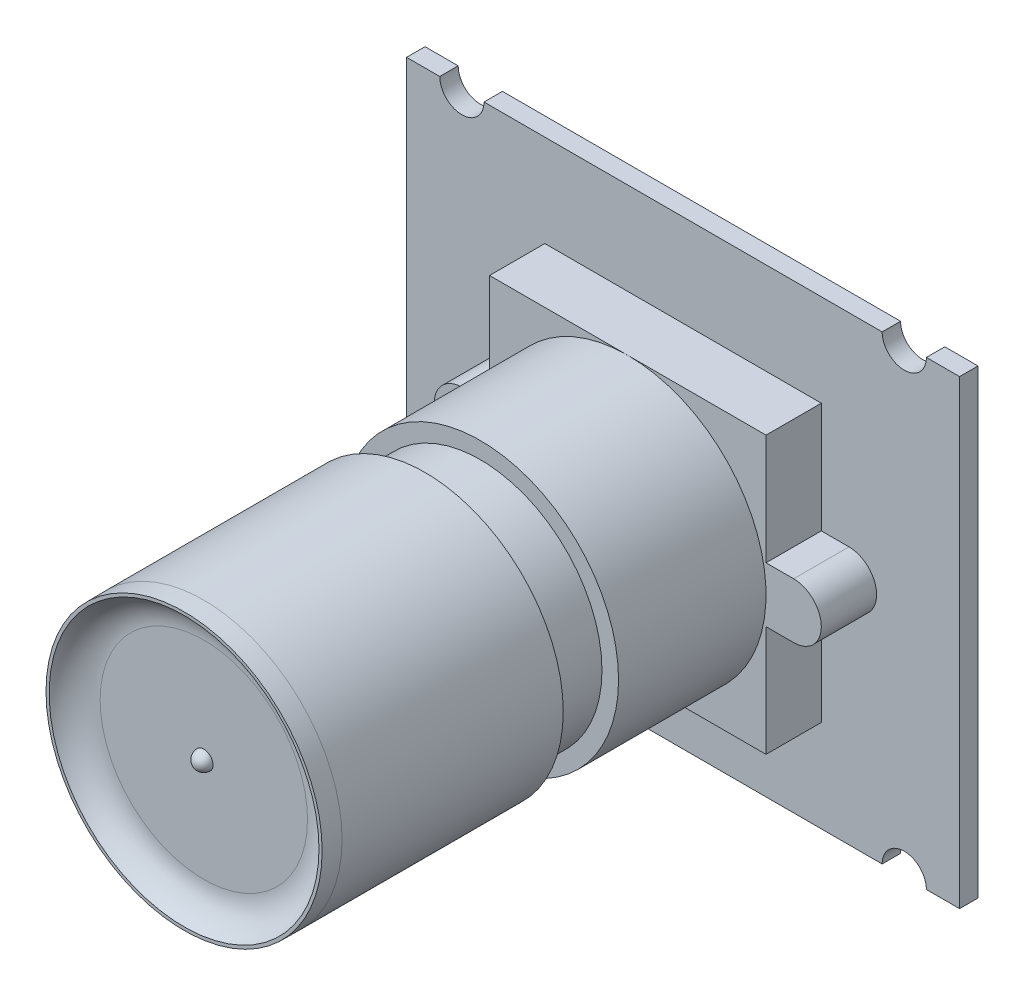
ISO-10303-21;
HEADER;
FILE_DESCRIPTION(('STEP AP214'),'2;1');
FILE_NAME('part.step','',(''),(''),'','','');
FILE_SCHEMA(('AUTOMOTIVE_DESIGN { 1 0 10303 214 1 1 1 1 }'));
ENDSEC;
DATA;
#1=APPLICATION_CONTEXT('core data for automotive mechanical design processes');
#2=APPLICATION_PROTOCOL_DEFINITION('international standard','automotive_design',2000,#1);
#3=PRODUCT_CONTEXT('',#1,'mechanical');
#4=PRODUCT('Part','Part','',(#3));
#5=PRODUCT_RELATED_PRODUCT_CATEGORY('part','',(#4));
#6=PRODUCT_DEFINITION_FORMATION('','',#4);
#7=PRODUCT_DEFINITION_CONTEXT('part definition',#1,'design');
#8=PRODUCT_DEFINITION('design','',#6,#7);
#9=PRODUCT_DEFINITION_SHAPE('','',#8);
#10=(LENGTH_UNIT() NAMED_UNIT(*) SI_UNIT(.MILLI.,.METRE.));
#11=(NAMED_UNIT(*) PLANE_ANGLE_UNIT() SI_UNIT($,.RADIAN.));
#12=(NAMED_UNIT(*) SI_UNIT($,.STERADIAN.) SOLID_ANGLE_UNIT());
#13=UNCERTAINTY_MEASURE_WITH_UNIT(LENGTH_MEASURE(1.E-05),#10,'distance_accuracy_value','');
#14=(GEOMETRIC_REPRESENTATION_CONTEXT(3) GLOBAL_UNCERTAINTY_ASSIGNED_CONTEXT((#13)) GLOBAL_UNIT_ASSIGNED_CONTEXT((#10,
#11,#12)) REPRESENTATION_CONTEXT('',''));
#15=CARTESIAN_POINT('',(0.,0.,0.));
#16=DIRECTION('',(0.,0.,1.));
#17=DIRECTION('',(1.,0.,0.));
#18=AXIS2_PLACEMENT_3D('',#15,#16,#17);
#19=CARTESIAN_POINT('',(6.,-3.54395604395604,4.));
#20=DIRECTION('',(0.,0.,1.));
#21=DIRECTION('',(1.,0.,0.));
#22=AXIS2_PLACEMENT_3D('',#19,#20,#21);
#23=PLANE('',#22);
#24=CARTESIAN_POINT('',(15.,-3.54395604395604,4.));
#25=DIRECTION('',(0.,0.,1.));
#26=DIRECTION('',(1.,0.,0.));
#27=AXIS2_PLACEMENT_3D('',#24,#25,#26);
#28=CIRCLE('',#27,7.5);
#29=CARTESIAN_POINT('',(15.,3.95604395604396,4.));
#30=VERTEX_POINT('',#29);
#31=CARTESIAN_POINT('',(15.,-11.043956043956,4.));
#32=VERTEX_POINT('',#31);
#33=EDGE_CURVE('E226',#30,#32,#28,.T.);
#34=ORIENTED_EDGE('',*,*,#33,.F.);
#35=DIRECTION('',(-1.,0.,0.));
#36=VECTOR('',#35,1.);
#37=CARTESIAN_POINT('',(7.5,3.95604395604396,4.));
#38=LINE('',#37,#36);
#39=CARTESIAN_POINT('',(7.5,3.95604395604396,4.));
#40=VERTEX_POINT('',#39);
#41=EDGE_CURVE('E214',#30,#40,#38,.T.);
#42=ORIENTED_EDGE('',*,*,#41,.T.);
#43=DIRECTION('',(0.,-1.,0.));
#44=VECTOR('',#43,1.);
#45=CARTESIAN_POINT('',(7.5,3.95604395604396,4.));
#46=LINE('',#45,#44);
#47=CARTESIAN_POINT('',(7.5,-2.04395604395604,4.));
#48=VERTEX_POINT('',#47);
#49=EDGE_CURVE('E239',#40,#48,#46,.T.);
#50=ORIENTED_EDGE('',*,*,#49,.T.);
#51=DIRECTION('',(-1.,0.,0.));
#52=VECTOR('',#51,1.);
#53=CARTESIAN_POINT('',(6.,-2.04395604395604,4.));
#54=LINE('',#53,#52);
#55=CARTESIAN_POINT('',(6.,-2.04395604395604,4.));
#56=VERTEX_POINT('',#55);
#57=EDGE_CURVE('E281',#48,#56,#54,.T.);
#58=ORIENTED_EDGE('',*,*,#57,.T.);
#59=CARTESIAN_POINT('',(6.,-3.54395604395604,4.));
#60=DIRECTION('',(0.,0.,1.));
#61=DIRECTION('',(1.,0.,0.));
#62=AXIS2_PLACEMENT_3D('',#59,#60,#61);
#63=CIRCLE('',#62,1.5);
#64=CARTESIAN_POINT('',(6.,-5.04395604395604,4.));
#65=VERTEX_POINT('',#64);
#66=EDGE_CURVE('E274',#56,#65,#63,.T.);
#67=ORIENTED_EDGE('',*,*,#66,.T.);
#68=DIRECTION('',(1.,0.,0.));
#69=VECTOR('',#68,1.);
#70=CARTESIAN_POINT('',(6.,-5.04395604395604,4.));
#71=LINE('',#70,#69);
#72=CARTESIAN_POINT('',(7.5,-5.04395604395604,4.));
#73=VERTEX_POINT('',#72);
#74=EDGE_CURVE('E278',#65,#73,#71,.T.);
#75=ORIENTED_EDGE('',*,*,#74,.T.);
#76=CARTESIAN_POINT('',(7.5,-11.043956043956,4.));
#77=VERTEX_POINT('',#76);
#78=EDGE_CURVE('E243',#73,#77,#46,.T.);
#79=ORIENTED_EDGE('',*,*,#78,.T.);
#80=DIRECTION('',(1.,0.,0.));
#81=VECTOR('',#80,1.);
#82=CARTESIAN_POINT('',(7.5,-11.043956043956,4.));
#83=LINE('',#82,#81);
#84=EDGE_CURVE('E229',#77,#32,#83,.T.);
#85=ORIENTED_EDGE('',*,*,#84,.T.);
#86=EDGE_LOOP('',(#34,#42,#50,#58,#67,#75,#79,#85));
#87=FACE_BOUND('',#86,.T.);
#88=ADVANCED_FACE('F39',(#87),#23,.T.);
#89=CARTESIAN_POINT('',(6.,-5.04395604395604,4.));
#90=DIRECTION('',(0.,1.,0.));
#91=DIRECTION('',(0.,0.,1.));
#92=AXIS2_PLACEMENT_3D('',#89,#90,#91);
#93=PLANE('',#92);
#94=DIRECTION('',(0.,0.,-1.));
#95=VECTOR('',#94,1.);
#96=CARTESIAN_POINT('',(7.5,-5.04395604395604,4.));
#97=LINE('',#96,#95);
#98=CARTESIAN_POINT('',(7.5,-5.04395604395604,1.));
#99=VERTEX_POINT('',#98);
#100=EDGE_CURVE('E268',#73,#99,#97,.T.);
#101=ORIENTED_EDGE('',*,*,#100,.F.);
#102=ORIENTED_EDGE('',*,*,#74,.F.);
#103=DIRECTION('',(0.,0.,-1.));
#104=VECTOR('',#103,1.);
#105=CARTESIAN_POINT('',(6.,-5.04395604395604,4.));
#106=LINE('',#105,#104);
#107=CARTESIAN_POINT('',(6.,-5.04395604395604,1.));
#108=VERTEX_POINT('',#107);
#109=EDGE_CURVE('E310',#65,#108,#106,.T.);
#110=ORIENTED_EDGE('',*,*,#109,.T.);
#111=DIRECTION('',(1.,0.,0.));
#112=VECTOR('',#111,1.);
#113=CARTESIAN_POINT('',(6.,-5.04395604395604,1.));
#114=LINE('',#113,#112);
#115=EDGE_CURVE('E293',#108,#99,#114,.T.);
#116=ORIENTED_EDGE('',*,*,#115,.T.);
#117=EDGE_LOOP('',(#101,#102,#110,#116));
#118=FACE_BOUND('',#117,.T.);
#119=ADVANCED_FACE('F425',(#118),#93,.F.);
#120=DIRECTION('',(0.,0.,1.));
#121=VECTOR('',#120,1.);
#122=CARTESIAN_POINT('',(22.5,-5.04395604395604,4.));
#123=LINE('',#122,#121);
#124=CARTESIAN_POINT('',(22.5,-5.04395604395604,1.));
#125=VERTEX_POINT('',#124);
#126=CARTESIAN_POINT('',(22.5,-5.04395604395604,4.));
#127=VERTEX_POINT('',#126);
#128=EDGE_CURVE('E269',#125,#127,#123,.T.);
#129=ORIENTED_EDGE('',*,*,#128,.F.);
#130=CARTESIAN_POINT('',(24.,-5.04395604395604,1.));
#131=VERTEX_POINT('',#130);
#132=EDGE_CURVE('E288',#125,#131,#114,.T.);
#133=ORIENTED_EDGE('',*,*,#132,.T.);
#134=DIRECTION('',(0.,0.,-1.));
#135=VECTOR('',#134,1.);
#136=CARTESIAN_POINT('',(24.,-5.04395604395604,4.));
#137=LINE('',#136,#135);
#138=CARTESIAN_POINT('',(24.,-5.04395604395604,4.));
#139=VERTEX_POINT('',#138);
#140=EDGE_CURVE('E302',#139,#131,#137,.T.);
#141=ORIENTED_EDGE('',*,*,#140,.F.);
#142=EDGE_CURVE('E280',#127,#139,#71,.T.);
#143=ORIENTED_EDGE('',*,*,#142,.F.);
#144=EDGE_LOOP('',(#129,#133,#141,#143));
#145=FACE_BOUND('',#144,.T.);
#146=ADVANCED_FACE('F436',(#145),#93,.F.);
#147=CARTESIAN_POINT('',(6.,-2.04395604395604,4.));
#148=DIRECTION('',(0.,-1.,0.));
#149=DIRECTION('',(0.,0.,-1.));
#150=AXIS2_PLACEMENT_3D('',#147,#148,#149);
#151=PLANE('',#150);
#152=DIRECTION('',(0.,0.,1.));
#153=VECTOR('',#152,1.);
#154=CARTESIAN_POINT('',(7.5,-2.04395604395604,4.));
#155=LINE('',#154,#153);
#156=CARTESIAN_POINT('',(7.5,-2.04395604395604,1.));
#157=VERTEX_POINT('',#156);
#158=EDGE_CURVE('E43',#157,#48,#155,.T.);
#159=ORIENTED_EDGE('',*,*,#158,.F.);
#160=DIRECTION('',(-1.,0.,0.));
#161=VECTOR('',#160,1.);
#162=CARTESIAN_POINT('',(6.,-2.04395604395604,1.));
#163=LINE('',#162,#161);
#164=CARTESIAN_POINT('',(6.,-2.04395604395604,1.));
#165=VERTEX_POINT('',#164);
#166=EDGE_CURVE('E300',#157,#165,#163,.T.);
#167=ORIENTED_EDGE('',*,*,#166,.T.);
#168=DIRECTION('',(0.,0.,-1.));
#169=VECTOR('',#168,1.);
#170=CARTESIAN_POINT('',(6.,-2.04395604395604,4.));
#171=LINE('',#170,#169);
#172=EDGE_CURVE('E289',#56,#165,#171,.T.);
#173=ORIENTED_EDGE('',*,*,#172,.F.);
#174=ORIENTED_EDGE('',*,*,#57,.F.);
#175=EDGE_LOOP('',(#159,#167,#173,#174));
#176=FACE_BOUND('',#175,.T.);
#177=ADVANCED_FACE('F416',(#176),#151,.F.);
#178=DIRECTION('',(0.,0.,-1.));
#179=VECTOR('',#178,1.);
#180=CARTESIAN_POINT('',(22.5,-2.04395604395604,4.));
#181=LINE('',#180,#179);
#182=CARTESIAN_POINT('',(22.5,-2.04395604395604,4.));
#183=VERTEX_POINT('',#182);
#184=CARTESIAN_POINT('',(22.5,-2.04395604395604,1.));
#185=VERTEX_POINT('',#184);
#186=EDGE_CURVE('E240',#183,#185,#181,.T.);
#187=ORIENTED_EDGE('',*,*,#186,.F.);
#188=CARTESIAN_POINT('',(24.,-2.04395604395604,4.));
#189=VERTEX_POINT('',#188);
#190=EDGE_CURVE('E283',#189,#183,#54,.T.);
#191=ORIENTED_EDGE('',*,*,#190,.F.);
#192=DIRECTION('',(0.,0.,-1.));
#193=VECTOR('',#192,1.);
#194=CARTESIAN_POINT('',(24.,-2.04395604395604,4.));
#195=LINE('',#194,#193);
#196=CARTESIAN_POINT('',(24.,-2.04395604395604,1.));
#197=VERTEX_POINT('',#196);
#198=EDGE_CURVE('E301',#189,#197,#195,.T.);
#199=ORIENTED_EDGE('',*,*,#198,.T.);
#200=EDGE_CURVE('E277',#197,#185,#163,.T.);
#201=ORIENTED_EDGE('',*,*,#200,.T.);
#202=EDGE_LOOP('',(#187,#191,#199,#201));
#203=FACE_BOUND('',#202,.T.);
#204=ADVANCED_FACE('F405',(#203),#151,.F.);
#205=CARTESIAN_POINT('',(0.,8.95604395604396,1.));
#206=DIRECTION('',(1.,0.,0.));
#207=DIRECTION('',(0.,1.,0.));
#208=AXIS2_PLACEMENT_3D('',#205,#206,#207);
#209=PLANE('',#208);
#210=DIRECTION('',(0.,-1.,0.));
#211=VECTOR('',#210,1.);
#212=CARTESIAN_POINT('',(0.,8.95604395604396,0.));
#213=LINE('',#212,#211);
#214=CARTESIAN_POINT('',(0.,8.95604395604396,0.));
#215=VERTEX_POINT('',#214);
#216=CARTESIAN_POINT('',(0.,-16.043956043956,0.));
#217=VERTEX_POINT('',#216);
#218=EDGE_CURVE('E309',#215,#217,#213,.T.);
#219=ORIENTED_EDGE('',*,*,#218,.T.);
#220=DIRECTION('',(0.,0.,-1.));
#221=VECTOR('',#220,1.);
#222=CARTESIAN_POINT('',(0.,-16.043956043956,1.));
#223=LINE('',#222,#221);
#224=CARTESIAN_POINT('',(0.,-16.043956043956,1.));
#225=VERTEX_POINT('',#224);
#226=EDGE_CURVE('E394',#225,#217,#223,.T.);
#227=ORIENTED_EDGE('',*,*,#226,.F.);
#228=DIRECTION('',(0.,-1.,0.));
#229=VECTOR('',#228,1.);
#230=CARTESIAN_POINT('',(0.,8.95604395604396,1.));
#231=LINE('',#230,#229);
#232=CARTESIAN_POINT('',(0.,8.95604395604396,1.));
#233=VERTEX_POINT('',#232);
#234=EDGE_CURVE('E311',#233,#225,#231,.T.);
#235=ORIENTED_EDGE('',*,*,#234,.F.);
#236=DIRECTION('',(0.,0.,-1.));
#237=VECTOR('',#236,1.);
#238=CARTESIAN_POINT('',(0.,8.95604395604396,1.));
#239=LINE('',#238,#237);
#240=EDGE_CURVE('E340',#233,#215,#239,.T.);
#241=ORIENTED_EDGE('',*,*,#240,.T.);
#242=EDGE_LOOP('',(#219,#227,#235,#241));
#243=FACE_BOUND('',#242,.T.);
#244=ADVANCED_FACE('F41',(#243),#209,.F.);
#245=CARTESIAN_POINT('',(0.,-16.043956043956,1.));
#246=DIRECTION('',(0.,1.,0.));
#247=DIRECTION('',(0.,0.,1.));
#248=AXIS2_PLACEMENT_3D('',#245,#246,#247);
#249=PLANE('',#248);
#250=DIRECTION('',(1.,0.,0.));
#251=VECTOR('',#250,1.);
#252=CARTESIAN_POINT('',(0.,-16.043956043956,0.));
#253=LINE('',#252,#251);
#254=CARTESIAN_POINT('',(1.8,-16.043956043956,0.));
#255=VERTEX_POINT('',#254);
#256=EDGE_CURVE('E338',#217,#255,#253,.T.);
#257=ORIENTED_EDGE('',*,*,#256,.T.);
#258=DIRECTION('',(0.,0.,-1.));
#259=VECTOR('',#258,1.);
#260=CARTESIAN_POINT('',(1.8,-16.043956043956,1.));
#261=LINE('',#260,#259);
#262=CARTESIAN_POINT('',(1.8,-16.043956043956,1.));
#263=VERTEX_POINT('',#262);
#264=EDGE_CURVE('E389',#263,#255,#261,.T.);
#265=ORIENTED_EDGE('',*,*,#264,.F.);
#266=DIRECTION('',(1.,0.,0.));
#267=VECTOR('',#266,1.);
#268=CARTESIAN_POINT('',(0.,-16.043956043956,1.));
#269=LINE('',#268,#267);
#270=EDGE_CURVE('E313',#225,#263,#269,.T.);
#271=ORIENTED_EDGE('',*,*,#270,.F.);
#272=ORIENTED_EDGE('',*,*,#226,.T.);
#273=EDGE_LOOP('',(#257,#265,#271,#272));
#274=FACE_BOUND('',#273,.T.);
#275=ADVANCED_FACE('F508',(#274),#249,.F.);
#276=CARTESIAN_POINT('',(3.,-16.043956043956,1.));
#277=DIRECTION('',(0.,0.,-1.));
#278=DIRECTION('',(-1.,0.,0.));
#279=AXIS2_PLACEMENT_3D('',#276,#277,#278);
#280=CYLINDRICAL_SURFACE('',#279,1.2);
#281=CARTESIAN_POINT('',(3.,-16.043956043956,0.));
#282=DIRECTION('',(0.,0.,-1.));
#283=DIRECTION('',(1.,0.,0.));
#284=AXIS2_PLACEMENT_3D('',#281,#282,#283);
#285=CIRCLE('',#284,1.2);
#286=CARTESIAN_POINT('',(4.2,-16.043956043956,0.));
#287=VERTEX_POINT('',#286);
#288=EDGE_CURVE('E345',#255,#287,#285,.T.);
#289=ORIENTED_EDGE('',*,*,#288,.T.);
#290=DIRECTION('',(0.,0.,-1.));
#291=VECTOR('',#290,1.);
#292=CARTESIAN_POINT('',(4.2,-16.043956043956,1.));
#293=LINE('',#292,#291);
#294=CARTESIAN_POINT('',(4.2,-16.043956043956,1.));
#295=VERTEX_POINT('',#294);
#296=EDGE_CURVE('E390',#295,#287,#293,.T.);
#297=ORIENTED_EDGE('',*,*,#296,.F.);
#298=CARTESIAN_POINT('',(3.,-16.043956043956,1.));
#299=DIRECTION('',(0.,0.,-1.));
#300=DIRECTION('',(1.,0.,0.));
#301=AXIS2_PLACEMENT_3D('',#298,#299,#300);
#302=CIRCLE('',#301,1.2);
#303=EDGE_CURVE('E320',#263,#295,#302,.T.);
#304=ORIENTED_EDGE('',*,*,#303,.F.);
#305=ORIENTED_EDGE('',*,*,#264,.T.);
#306=EDGE_LOOP('',(#289,#297,#304,#305));
#307=FACE_BOUND('',#306,.T.);
#308=ADVANCED_FACE('F506',(#307),#280,.F.);
#309=CARTESIAN_POINT('',(4.2,-16.043956043956,1.));
#310=DIRECTION('',(0.,1.,0.));
#311=DIRECTION('',(0.,0.,1.));
#312=AXIS2_PLACEMENT_3D('',#309,#310,#311);
#313=PLANE('',#312);
#314=DIRECTION('',(1.,0.,0.));
#315=VECTOR('',#314,1.);
#316=CARTESIAN_POINT('',(4.2,-16.043956043956,0.));
#317=LINE('',#316,#315);
#318=CARTESIAN_POINT('',(25.8,-16.043956043956,0.));
#319=VERTEX_POINT('',#318);
#320=EDGE_CURVE('E343',#287,#319,#317,.T.);
#321=ORIENTED_EDGE('',*,*,#320,.T.);
#322=DIRECTION('',(0.,0.,-1.));
#323=VECTOR('',#322,1.);
#324=CARTESIAN_POINT('',(25.8,-16.043956043956,1.));
#325=LINE('',#324,#323);
#326=CARTESIAN_POINT('',(25.8,-16.043956043956,1.));
#327=VERTEX_POINT('',#326);
#328=EDGE_CURVE('E381',#327,#319,#325,.T.);
#329=ORIENTED_EDGE('',*,*,#328,.F.);
#330=DIRECTION('',(1.,0.,0.));
#331=VECTOR('',#330,1.);
#332=CARTESIAN_POINT('',(4.2,-16.043956043956,1.));
#333=LINE('',#332,#331);
#334=EDGE_CURVE('E316',#295,#327,#333,.T.);
#335=ORIENTED_EDGE('',*,*,#334,.F.);
#336=ORIENTED_EDGE('',*,*,#296,.T.);
#337=EDGE_LOOP('',(#321,#329,#335,#336));
#338=FACE_BOUND('',#337,.T.);
#339=ADVANCED_FACE('F505',(#338),#313,.F.);
#340=CARTESIAN_POINT('',(27.,-16.043956043956,1.));
#341=DIRECTION('',(0.,0.,-1.));
#342=DIRECTION('',(-1.,0.,0.));
#343=AXIS2_PLACEMENT_3D('',#340,#341,#342);
#344=CYLINDRICAL_SURFACE('',#343,1.2);
#345=CARTESIAN_POINT('',(27.,-16.043956043956,0.));
#346=DIRECTION('',(0.,0.,-1.));
#347=DIRECTION('',(1.,0.,0.));
#348=AXIS2_PLACEMENT_3D('',#345,#346,#347);
#349=CIRCLE('',#348,1.2);
#350=CARTESIAN_POINT('',(28.2,-16.043956043956,0.));
#351=VERTEX_POINT('',#350);
#352=EDGE_CURVE('E347',#319,#351,#349,.T.);
#353=ORIENTED_EDGE('',*,*,#352,.T.);
#354=DIRECTION('',(0.,0.,-1.));
#355=VECTOR('',#354,1.);
#356=CARTESIAN_POINT('',(28.2,-16.043956043956,1.));
#357=LINE('',#356,#355);
#358=CARTESIAN_POINT('',(28.2,-16.043956043956,1.));
#359=VERTEX_POINT('',#358);
#360=EDGE_CURVE('E382',#359,#351,#357,.T.);
#361=ORIENTED_EDGE('',*,*,#360,.F.);
#362=CARTESIAN_POINT('',(27.,-16.043956043956,1.));
#363=DIRECTION('',(0.,0.,-1.));
#364=DIRECTION('',(1.,0.,0.));
#365=AXIS2_PLACEMENT_3D('',#362,#363,#364);
#366=CIRCLE('',#365,1.2);
#367=EDGE_CURVE('E321',#327,#359,#366,.T.);
#368=ORIENTED_EDGE('',*,*,#367,.F.);
#369=ORIENTED_EDGE('',*,*,#328,.T.);
#370=EDGE_LOOP('',(#353,#361,#368,#369));
#371=FACE_BOUND('',#370,.T.);
#372=ADVANCED_FACE('F498',(#371),#344,.F.);
#373=CARTESIAN_POINT('',(28.2,-16.043956043956,1.));
#374=DIRECTION('',(0.,1.,0.));
#375=DIRECTION('',(0.,0.,1.));
#376=AXIS2_PLACEMENT_3D('',#373,#374,#375);
#377=PLANE('',#376);
#378=DIRECTION('',(1.,0.,0.));
#379=VECTOR('',#378,1.);
#380=CARTESIAN_POINT('',(28.2,-16.043956043956,0.));
#381=LINE('',#380,#379);
#382=CARTESIAN_POINT('',(30.,-16.043956043956,0.));
#383=VERTEX_POINT('',#382);
#384=EDGE_CURVE('E349',#351,#383,#381,.T.);
#385=ORIENTED_EDGE('',*,*,#384,.T.);
#386=DIRECTION('',(0.,0.,-1.));
#387=VECTOR('',#386,1.);
#388=CARTESIAN_POINT('',(30.,-16.043956043956,1.));
#389=LINE('',#388,#387);
#390=CARTESIAN_POINT('',(30.,-16.043956043956,1.));
#391=VERTEX_POINT('',#390);
#392=EDGE_CURVE('E377',#391,#383,#389,.T.);
#393=ORIENTED_EDGE('',*,*,#392,.F.);
#394=DIRECTION('',(1.,0.,0.));
#395=VECTOR('',#394,1.);
#396=CARTESIAN_POINT('',(28.2,-16.043956043956,1.));
#397=LINE('',#396,#395);
#398=EDGE_CURVE('E322',#359,#391,#397,.T.);
#399=ORIENTED_EDGE('',*,*,#398,.F.);
#400=ORIENTED_EDGE('',*,*,#360,.T.);
#401=EDGE_LOOP('',(#385,#393,#399,#400));
#402=FACE_BOUND('',#401,.T.);
#403=ADVANCED_FACE('F494',(#402),#377,.F.);
#404=CARTESIAN_POINT('',(30.,8.95604395604396,1.));
#405=DIRECTION('',(-1.,0.,0.));
#406=DIRECTION('',(0.,-1.,0.));
#407=AXIS2_PLACEMENT_3D('',#404,#405,#406);
#408=PLANE('',#407);
#409=DIRECTION('',(0.,1.,0.));
#410=VECTOR('',#409,1.);
#411=CARTESIAN_POINT('',(30.,8.95604395604396,0.));
#412=LINE('',#411,#410);
#413=CARTESIAN_POINT('',(30.,8.95604395604396,0.));
#414=VERTEX_POINT('',#413);
#415=EDGE_CURVE('E348',#383,#414,#412,.T.);
#416=ORIENTED_EDGE('',*,*,#415,.T.);
#417=DIRECTION('',(0.,0.,-1.));
#418=VECTOR('',#417,1.);
#419=CARTESIAN_POINT('',(30.,8.95604395604396,1.));
#420=LINE('',#419,#418);
#421=CARTESIAN_POINT('',(30.,8.95604395604396,1.));
#422=VERTEX_POINT('',#421);
#423=EDGE_CURVE('E374',#422,#414,#420,.T.);
#424=ORIENTED_EDGE('',*,*,#423,.F.);
#425=DIRECTION('',(0.,1.,0.));
#426=VECTOR('',#425,1.);
#427=CARTESIAN_POINT('',(30.,8.95604395604396,1.));
#428=LINE('',#427,#426);
#429=EDGE_CURVE('E324',#391,#422,#428,.T.);
#430=ORIENTED_EDGE('',*,*,#429,.F.);
#431=ORIENTED_EDGE('',*,*,#392,.T.);
#432=EDGE_LOOP('',(#416,#424,#430,#431));
#433=FACE_BOUND('',#432,.T.);
#434=ADVANCED_FACE('F489',(#433),#408,.F.);
#435=CARTESIAN_POINT('',(28.2,8.95604395604396,1.));
#436=DIRECTION('',(0.,-1.,0.));
#437=DIRECTION('',(0.,0.,-1.));
#438=AXIS2_PLACEMENT_3D('',#435,#436,#437);
#439=PLANE('',#438);
#440=DIRECTION('',(-1.,0.,0.));
#441=VECTOR('',#440,1.);
#442=CARTESIAN_POINT('',(28.2,8.95604395604396,0.));
#443=LINE('',#442,#441);
#444=CARTESIAN_POINT('',(28.2,8.95604395604396,0.));
#445=VERTEX_POINT('',#444);
#446=EDGE_CURVE('E354',#414,#445,#443,.T.);
#447=ORIENTED_EDGE('',*,*,#446,.T.);
#448=DIRECTION('',(0.,0.,-1.));
#449=VECTOR('',#448,1.);
#450=CARTESIAN_POINT('',(28.2,8.95604395604396,1.));
#451=LINE('',#450,#449);
#452=CARTESIAN_POINT('',(28.2,8.95604395604396,1.));
#453=VERTEX_POINT('',#452);
#454=EDGE_CURVE('E375',#453,#445,#451,.T.);
#455=ORIENTED_EDGE('',*,*,#454,.F.);
#456=DIRECTION('',(-1.,0.,0.));
#457=VECTOR('',#456,1.);
#458=CARTESIAN_POINT('',(28.2,8.95604395604396,1.));
#459=LINE('',#458,#457);
#460=EDGE_CURVE('E330',#422,#453,#459,.T.);
#461=ORIENTED_EDGE('',*,*,#460,.F.);
#462=ORIENTED_EDGE('',*,*,#423,.T.);
#463=EDGE_LOOP('',(#447,#455,#461,#462));
#464=FACE_BOUND('',#463,.T.);
#465=ADVANCED_FACE('F488',(#464),#439,.F.);
#466=CARTESIAN_POINT('',(27.,8.95604395604396,1.));
#467=DIRECTION('',(0.,0.,-1.));
#468=DIRECTION('',(-1.,0.,0.));
#469=AXIS2_PLACEMENT_3D('',#466,#467,#468);
#470=CYLINDRICAL_SURFACE('',#469,1.2);
#471=CARTESIAN_POINT('',(27.,8.95604395604396,0.));
#472=DIRECTION('',(0.,0.,-1.));
#473=DIRECTION('',(1.,0.,0.));
#474=AXIS2_PLACEMENT_3D('',#471,#472,#473);
#475=CIRCLE('',#474,1.2);
#476=CARTESIAN_POINT('',(25.8,8.95604395604396,0.));
#477=VERTEX_POINT('',#476);
#478=EDGE_CURVE('E351',#445,#477,#475,.T.);
#479=ORIENTED_EDGE('',*,*,#478,.T.);
#480=DIRECTION('',(0.,0.,-1.));
#481=VECTOR('',#480,1.);
#482=CARTESIAN_POINT('',(25.8,8.95604395604396,1.));
#483=LINE('',#482,#481);
#484=CARTESIAN_POINT('',(25.8,8.95604395604396,1.));
#485=VERTEX_POINT('',#484);
#486=EDGE_CURVE('E367',#485,#477,#483,.T.);
#487=ORIENTED_EDGE('',*,*,#486,.F.);
#488=CARTESIAN_POINT('',(27.,8.95604395604396,1.));
#489=DIRECTION('',(0.,0.,-1.));
#490=DIRECTION('',(1.,0.,0.));
#491=AXIS2_PLACEMENT_3D('',#488,#489,#490);
#492=CIRCLE('',#491,1.2);
#493=EDGE_CURVE('E326',#453,#485,#492,.T.);
#494=ORIENTED_EDGE('',*,*,#493,.F.);
#495=ORIENTED_EDGE('',*,*,#454,.T.);
#496=EDGE_LOOP('',(#479,#487,#494,#495));
#497=FACE_BOUND('',#496,.T.);
#498=ADVANCED_FACE('F484',(#497),#470,.F.);
#499=CARTESIAN_POINT('',(4.2,8.95604395604396,1.));
#500=DIRECTION('',(0.,-1.,0.));
#501=DIRECTION('',(0.,0.,-1.));
#502=AXIS2_PLACEMENT_3D('',#499,#500,#501);
#503=PLANE('',#502);
#504=DIRECTION('',(-1.,0.,0.));
#505=VECTOR('',#504,1.);
#506=CARTESIAN_POINT('',(4.2,8.95604395604396,0.));
#507=LINE('',#506,#505);
#508=CARTESIAN_POINT('',(4.2,8.95604395604396,0.));
#509=VERTEX_POINT('',#508);
#510=EDGE_CURVE('E358',#477,#509,#507,.T.);
#511=ORIENTED_EDGE('',*,*,#510,.T.);
#512=DIRECTION('',(0.,0.,-1.));
#513=VECTOR('',#512,1.);
#514=CARTESIAN_POINT('',(4.2,8.95604395604396,1.));
#515=LINE('',#514,#513);
#516=CARTESIAN_POINT('',(4.2,8.95604395604396,1.));
#517=VERTEX_POINT('',#516);
#518=EDGE_CURVE('E366',#517,#509,#515,.T.);
#519=ORIENTED_EDGE('',*,*,#518,.F.);
#520=DIRECTION('',(-1.,0.,0.));
#521=VECTOR('',#520,1.);
#522=CARTESIAN_POINT('',(4.2,8.95604395604396,1.));
#523=LINE('',#522,#521);
#524=EDGE_CURVE('E332',#485,#517,#523,.T.);
#525=ORIENTED_EDGE('',*,*,#524,.F.);
#526=ORIENTED_EDGE('',*,*,#486,.T.);
#527=EDGE_LOOP('',(#511,#519,#525,#526));
#528=FACE_BOUND('',#527,.T.);
#529=ADVANCED_FACE('F479',(#528),#503,.F.);
#530=CARTESIAN_POINT('',(3.,8.95604395604396,1.));
#531=DIRECTION('',(0.,0.,-1.));
#532=DIRECTION('',(-1.,0.,0.));
#533=AXIS2_PLACEMENT_3D('',#530,#531,#532);
#534=CYLINDRICAL_SURFACE('',#533,1.2);
#535=CARTESIAN_POINT('',(3.,8.95604395604396,0.));
#536=DIRECTION('',(0.,0.,-1.));
#537=DIRECTION('',(1.,0.,0.));
#538=AXIS2_PLACEMENT_3D('',#535,#536,#537);
#539=CIRCLE('',#538,1.2);
#540=CARTESIAN_POINT('',(1.8,8.95604395604396,0.));
#541=VERTEX_POINT('',#540);
#542=EDGE_CURVE('E356',#509,#541,#539,.T.);
#543=ORIENTED_EDGE('',*,*,#542,.T.);
#544=DIRECTION('',(0.,0.,-1.));
#545=VECTOR('',#544,1.);
#546=CARTESIAN_POINT('',(1.8,8.95604395604396,1.));
#547=LINE('',#546,#545);
#548=CARTESIAN_POINT('',(1.8,8.95604395604396,1.));
#549=VERTEX_POINT('',#548);
#550=EDGE_CURVE('E361',#549,#541,#547,.T.);
#551=ORIENTED_EDGE('',*,*,#550,.F.);
#552=CARTESIAN_POINT('',(3.,8.95604395604396,1.));
#553=DIRECTION('',(0.,0.,-1.));
#554=DIRECTION('',(1.,0.,0.));
#555=AXIS2_PLACEMENT_3D('',#552,#553,#554);
#556=CIRCLE('',#555,1.2);
#557=EDGE_CURVE('E335',#517,#549,#556,.T.);
#558=ORIENTED_EDGE('',*,*,#557,.F.);
#559=ORIENTED_EDGE('',*,*,#518,.T.);
#560=EDGE_LOOP('',(#543,#551,#558,#559));
#561=FACE_BOUND('',#560,.T.);
#562=ADVANCED_FACE('F473',(#561),#534,.F.);
#563=CARTESIAN_POINT('',(0.,8.95604395604396,1.));
#564=DIRECTION('',(0.,-1.,0.));
#565=DIRECTION('',(0.,0.,-1.));
#566=AXIS2_PLACEMENT_3D('',#563,#564,#565);
#567=PLANE('',#566);
#568=DIRECTION('',(-1.,0.,0.));
#569=VECTOR('',#568,1.);
#570=CARTESIAN_POINT('',(0.,8.95604395604396,0.));
#571=LINE('',#570,#569);
#572=EDGE_CURVE('E314',#541,#215,#571,.T.);
#573=ORIENTED_EDGE('',*,*,#572,.T.);
#574=ORIENTED_EDGE('',*,*,#240,.F.);
#575=DIRECTION('',(-1.,0.,0.));
#576=VECTOR('',#575,1.);
#577=CARTESIAN_POINT('',(0.,8.95604395604396,1.));
#578=LINE('',#577,#576);
#579=EDGE_CURVE('E333',#549,#233,#578,.T.);
#580=ORIENTED_EDGE('',*,*,#579,.F.);
#581=ORIENTED_EDGE('',*,*,#550,.T.);
#582=EDGE_LOOP('',(#573,#574,#580,#581));
#583=FACE_BOUND('',#582,.T.);
#584=ADVANCED_FACE('F468',(#583),#567,.F.);
#585=CARTESIAN_POINT('',(3.,-16.043956043956,1.));
#586=DIRECTION('',(0.,0.,1.));
#587=DIRECTION('',(1.,0.,0.));
#588=AXIS2_PLACEMENT_3D('',#585,#586,#587);
#589=PLANE('',#588);
#590=DIRECTION('',(0.,-1.,0.));
#591=VECTOR('',#590,1.);
#592=CARTESIAN_POINT('',(7.5,3.95604395604396,1.));
#593=LINE('',#592,#591);
#594=CARTESIAN_POINT('',(7.5,3.95604395604396,1.));
#595=VERTEX_POINT('',#594);
#596=EDGE_CURVE('E250',#595,#157,#593,.T.);
#597=ORIENTED_EDGE('',*,*,#596,.F.);
#598=DIRECTION('',(-1.,0.,0.));
#599=VECTOR('',#598,1.);
#600=CARTESIAN_POINT('',(7.5,3.95604395604396,1.));
#601=LINE('',#600,#599);
#602=CARTESIAN_POINT('',(22.5,3.95604395604396,1.));
#603=VERTEX_POINT('',#602);
#604=EDGE_CURVE('E256',#603,#595,#601,.T.);
#605=ORIENTED_EDGE('',*,*,#604,.F.);
#606=DIRECTION('',(0.,1.,0.));
#607=VECTOR('',#606,1.);
#608=CARTESIAN_POINT('',(22.5,3.95604395604396,1.));
#609=LINE('',#608,#607);
#610=EDGE_CURVE('E255',#185,#603,#609,.T.);
#611=ORIENTED_EDGE('',*,*,#610,.F.);
#612=ORIENTED_EDGE('',*,*,#200,.F.);
#613=CARTESIAN_POINT('',(24.,-3.54395604395604,1.));
#614=DIRECTION('',(0.,0.,1.));
#615=DIRECTION('',(1.,0.,0.));
#616=AXIS2_PLACEMENT_3D('',#613,#614,#615);
#617=CIRCLE('',#616,1.5);
#618=EDGE_CURVE('E295',#131,#197,#617,.T.);
#619=ORIENTED_EDGE('',*,*,#618,.F.);
#620=ORIENTED_EDGE('',*,*,#132,.F.);
#621=CARTESIAN_POINT('',(22.5,-11.043956043956,1.));
#622=VERTEX_POINT('',#621);
#623=EDGE_CURVE('E254',#622,#125,#609,.T.);
#624=ORIENTED_EDGE('',*,*,#623,.F.);
#625=DIRECTION('',(1.,0.,0.));
#626=VECTOR('',#625,1.);
#627=CARTESIAN_POINT('',(7.5,-11.043956043956,1.));
#628=LINE('',#627,#626);
#629=CARTESIAN_POINT('',(7.5,-11.043956043956,1.));
#630=VERTEX_POINT('',#629);
#631=EDGE_CURVE('E62',#630,#622,#628,.T.);
#632=ORIENTED_EDGE('',*,*,#631,.F.);
#633=EDGE_CURVE('E249',#99,#630,#593,.T.);
#634=ORIENTED_EDGE('',*,*,#633,.F.);
#635=ORIENTED_EDGE('',*,*,#115,.F.);
#636=CARTESIAN_POINT('',(6.,-3.54395604395604,1.));
#637=DIRECTION('',(0.,0.,1.));
#638=DIRECTION('',(1.,0.,0.));
#639=AXIS2_PLACEMENT_3D('',#636,#637,#638);
#640=CIRCLE('',#639,1.5);
#641=EDGE_CURVE('E271',#165,#108,#640,.T.);
#642=ORIENTED_EDGE('',*,*,#641,.F.);
#643=ORIENTED_EDGE('',*,*,#166,.F.);
#644=EDGE_LOOP('',(#597,#605,#611,#612,#619,#620,#624,#632,#634,#635,#642,#643));
#645=FACE_BOUND('',#644,.T.);
#646=ORIENTED_EDGE('',*,*,#234,.T.);
#647=ORIENTED_EDGE('',*,*,#270,.T.);
#648=ORIENTED_EDGE('',*,*,#303,.T.);
#649=ORIENTED_EDGE('',*,*,#334,.T.);
#650=ORIENTED_EDGE('',*,*,#367,.T.);
#651=ORIENTED_EDGE('',*,*,#398,.T.);
#652=ORIENTED_EDGE('',*,*,#429,.T.);
#653=ORIENTED_EDGE('',*,*,#460,.T.);
#654=ORIENTED_EDGE('',*,*,#493,.T.);
#655=ORIENTED_EDGE('',*,*,#524,.T.);
#656=ORIENTED_EDGE('',*,*,#557,.T.);
#657=ORIENTED_EDGE('',*,*,#579,.T.);
#658=EDGE_LOOP('',(#646,#647,#648,#649,#650,#651,#652,#653,#654,#655,#656,#657));
#659=FACE_BOUND('',#658,.T.);
#660=ADVANCED_FACE('F409',(#645,#659),#589,.T.);
#661=CARTESIAN_POINT('',(3.,-16.043956043956,0.));
#662=DIRECTION('',(0.,0.,1.));
#663=DIRECTION('',(1.,0.,0.));
#664=AXIS2_PLACEMENT_3D('',#661,#662,#663);
#665=PLANE('',#664);
#666=ORIENTED_EDGE('',*,*,#218,.F.);
#667=ORIENTED_EDGE('',*,*,#572,.F.);
#668=ORIENTED_EDGE('',*,*,#542,.F.);
#669=ORIENTED_EDGE('',*,*,#510,.F.);
#670=ORIENTED_EDGE('',*,*,#478,.F.);
#671=ORIENTED_EDGE('',*,*,#446,.F.);
#672=ORIENTED_EDGE('',*,*,#415,.F.);
#673=ORIENTED_EDGE('',*,*,#384,.F.);
#674=ORIENTED_EDGE('',*,*,#352,.F.);
#675=ORIENTED_EDGE('',*,*,#320,.F.);
#676=ORIENTED_EDGE('',*,*,#288,.F.);
#677=ORIENTED_EDGE('',*,*,#256,.F.);
#678=EDGE_LOOP('',(#666,#667,#668,#669,#670,#671,#672,#673,#674,#675,#676,#677));
#679=FACE_BOUND('',#678,.T.);
#680=ADVANCED_FACE('F464',(#679),#665,.F.);
#681=CARTESIAN_POINT('',(6.,-3.54395604395604,4.));
#682=DIRECTION('',(0.,0.,-1.));
#683=DIRECTION('',(-1.,0.,0.));
#684=AXIS2_PLACEMENT_3D('',#681,#682,#683);
#685=CYLINDRICAL_SURFACE('',#684,1.5);
#686=ORIENTED_EDGE('',*,*,#641,.T.);
#687=ORIENTED_EDGE('',*,*,#109,.F.);
#688=ORIENTED_EDGE('',*,*,#66,.F.);
#689=ORIENTED_EDGE('',*,*,#172,.T.);
#690=EDGE_LOOP('',(#686,#687,#688,#689));
#691=FACE_BOUND('',#690,.T.);
#692=ADVANCED_FACE('F422',(#691),#685,.T.);
#693=CARTESIAN_POINT('',(24.,-3.54395604395604,4.));
#694=DIRECTION('',(0.,0.,-1.));
#695=DIRECTION('',(-1.,0.,0.));
#696=AXIS2_PLACEMENT_3D('',#693,#694,#695);
#697=CYLINDRICAL_SURFACE('',#696,1.5);
#698=ORIENTED_EDGE('',*,*,#618,.T.);
#699=ORIENTED_EDGE('',*,*,#198,.F.);
#700=CARTESIAN_POINT('',(24.,-3.54395604395604,4.));
#701=DIRECTION('',(0.,0.,1.));
#702=DIRECTION('',(1.,0.,0.));
#703=AXIS2_PLACEMENT_3D('',#700,#701,#702);
#704=CIRCLE('',#703,1.5);
#705=EDGE_CURVE('E285',#139,#189,#704,.T.);
#706=ORIENTED_EDGE('',*,*,#705,.F.);
#707=ORIENTED_EDGE('',*,*,#140,.T.);
#708=EDGE_LOOP('',(#698,#699,#706,#707));
#709=FACE_BOUND('',#708,.T.);
#710=ADVANCED_FACE('F410',(#709),#697,.T.);
#711=EDGE_CURVE('E48',#32,#30,#28,.T.);
#712=ORIENTED_EDGE('',*,*,#711,.F.);
#713=CARTESIAN_POINT('',(22.5,-11.043956043956,4.));
#714=VERTEX_POINT('',#713);
#715=EDGE_CURVE('E245',#32,#714,#83,.T.);
#716=ORIENTED_EDGE('',*,*,#715,.T.);
#717=DIRECTION('',(0.,1.,0.));
#718=VECTOR('',#717,1.);
#719=CARTESIAN_POINT('',(22.5,3.95604395604396,4.));
#720=LINE('',#719,#718);
#721=EDGE_CURVE('E223',#714,#127,#720,.T.);
#722=ORIENTED_EDGE('',*,*,#721,.T.);
#723=ORIENTED_EDGE('',*,*,#142,.T.);
#724=ORIENTED_EDGE('',*,*,#705,.T.);
#725=ORIENTED_EDGE('',*,*,#190,.T.);
#726=CARTESIAN_POINT('',(22.5,3.95604395604396,4.));
#727=VERTEX_POINT('',#726);
#728=EDGE_CURVE('E208',#183,#727,#720,.T.);
#729=ORIENTED_EDGE('',*,*,#728,.T.);
#730=EDGE_CURVE('E203',#727,#30,#38,.T.);
#731=ORIENTED_EDGE('',*,*,#730,.T.);
#732=EDGE_LOOP('',(#712,#716,#722,#723,#724,#725,#729,#731));
#733=FACE_BOUND('',#732,.T.);
#734=ADVANCED_FACE('F210',(#733),#23,.T.);
#735=CARTESIAN_POINT('',(22.5,3.95604395604396,4.));
#736=DIRECTION('',(-1.,0.,0.));
#737=DIRECTION('',(0.,0.,1.));
#738=AXIS2_PLACEMENT_3D('',#735,#736,#737);
#739=PLANE('',#738);
#740=ORIENTED_EDGE('',*,*,#728,.F.);
#741=ORIENTED_EDGE('',*,*,#186,.T.);
#742=ORIENTED_EDGE('',*,*,#610,.T.);
#743=DIRECTION('',(0.,0.,-1.));
#744=VECTOR('',#743,1.);
#745=CARTESIAN_POINT('',(22.5,3.95604395604396,4.));
#746=LINE('',#745,#744);
#747=EDGE_CURVE('E258',#727,#603,#746,.T.);
#748=ORIENTED_EDGE('',*,*,#747,.F.);
#749=EDGE_LOOP('',(#740,#741,#742,#748));
#750=FACE_BOUND('',#749,.T.);
#751=ADVANCED_FACE('F400',(#750),#739,.F.);
#752=CARTESIAN_POINT('',(7.5,3.95604395604396,4.));
#753=DIRECTION('',(1.,0.,0.));
#754=DIRECTION('',(0.,0.,-1.));
#755=AXIS2_PLACEMENT_3D('',#752,#753,#754);
#756=PLANE('',#755);
#757=ORIENTED_EDGE('',*,*,#596,.T.);
#758=ORIENTED_EDGE('',*,*,#158,.T.);
#759=ORIENTED_EDGE('',*,*,#49,.F.);
#760=DIRECTION('',(0.,0.,-1.));
#761=VECTOR('',#760,1.);
#762=CARTESIAN_POINT('',(7.5,3.95604395604396,4.));
#763=LINE('',#762,#761);
#764=EDGE_CURVE('E213',#40,#595,#763,.T.);
#765=ORIENTED_EDGE('',*,*,#764,.T.);
#766=EDGE_LOOP('',(#757,#758,#759,#765));
#767=FACE_BOUND('',#766,.T.);
#768=ADVANCED_FACE('F411',(#767),#756,.F.);
#769=CARTESIAN_POINT('',(7.5,3.95604395604396,4.));
#770=DIRECTION('',(0.,-1.,0.));
#771=DIRECTION('',(0.,0.,-1.));
#772=AXIS2_PLACEMENT_3D('',#769,#770,#771);
#773=PLANE('',#772);
#774=ORIENTED_EDGE('',*,*,#604,.T.);
#775=ORIENTED_EDGE('',*,*,#764,.F.);
#776=ORIENTED_EDGE('',*,*,#41,.F.);
#777=ORIENTED_EDGE('',*,*,#730,.F.);
#778=ORIENTED_EDGE('',*,*,#747,.T.);
#779=EDGE_LOOP('',(#774,#775,#776,#777,#778));
#780=FACE_BOUND('',#779,.T.);
#781=ADVANCED_FACE('F218',(#780),#773,.F.);
#782=ORIENTED_EDGE('',*,*,#78,.F.);
#783=ORIENTED_EDGE('',*,*,#100,.T.);
#784=ORIENTED_EDGE('',*,*,#633,.T.);
#785=DIRECTION('',(0.,0.,-1.));
#786=VECTOR('',#785,1.);
#787=CARTESIAN_POINT('',(7.5,-11.043956043956,4.));
#788=LINE('',#787,#786);
#789=EDGE_CURVE('E261',#77,#630,#788,.T.);
#790=ORIENTED_EDGE('',*,*,#789,.F.);
#791=EDGE_LOOP('',(#782,#783,#784,#790));
#792=FACE_BOUND('',#791,.T.);
#793=ADVANCED_FACE('F426',(#792),#756,.F.);
#794=ORIENTED_EDGE('',*,*,#623,.T.);
#795=ORIENTED_EDGE('',*,*,#128,.T.);
#796=ORIENTED_EDGE('',*,*,#721,.F.);
#797=DIRECTION('',(0.,0.,-1.));
#798=VECTOR('',#797,1.);
#799=CARTESIAN_POINT('',(22.5,-11.043956043956,4.));
#800=LINE('',#799,#798);
#801=EDGE_CURVE('E262',#714,#622,#800,.T.);
#802=ORIENTED_EDGE('',*,*,#801,.T.);
#803=EDGE_LOOP('',(#794,#795,#796,#802));
#804=FACE_BOUND('',#803,.T.);
#805=ADVANCED_FACE('F432',(#804),#739,.F.);
#806=CARTESIAN_POINT('',(7.5,-11.043956043956,4.));
#807=DIRECTION('',(0.,1.,0.));
#808=DIRECTION('',(0.,0.,1.));
#809=AXIS2_PLACEMENT_3D('',#806,#807,#808);
#810=PLANE('',#809);
#811=ORIENTED_EDGE('',*,*,#631,.T.);
#812=ORIENTED_EDGE('',*,*,#801,.F.);
#813=ORIENTED_EDGE('',*,*,#715,.F.);
#814=ORIENTED_EDGE('',*,*,#84,.F.);
#815=ORIENTED_EDGE('',*,*,#789,.T.);
#816=EDGE_LOOP('',(#811,#812,#813,#814,#815));
#817=FACE_BOUND('',#816,.T.);
#818=ADVANCED_FACE('F427',(#817),#810,.F.);
#819=CARTESIAN_POINT('',(15.,-3.54395604395604,12.));
#820=DIRECTION('',(0.,0.,-1.));
#821=DIRECTION('',(-1.,0.,0.));
#822=AXIS2_PLACEMENT_3D('',#819,#820,#821);
#823=CYLINDRICAL_SURFACE('',#822,7.5);
#824=CARTESIAN_POINT('',(15.,-3.54395604395604,12.));
#825=DIRECTION('',(0.,0.,1.));
#826=DIRECTION('',(1.,0.,0.));
#827=AXIS2_PLACEMENT_3D('',#824,#825,#826);
#828=CIRCLE('',#827,7.5);
#829=CARTESIAN_POINT('',(22.5,-3.54395604395604,12.));
#830=VERTEX_POINT('',#829);
#831=EDGE_CURVE('E235',#830,#830,#828,.T.);
#832=ORIENTED_EDGE('',*,*,#831,.F.);
#833=EDGE_LOOP('',(#832));
#834=FACE_BOUND('',#833,.T.);
#835=ORIENTED_EDGE('',*,*,#33,.T.);
#836=ORIENTED_EDGE('',*,*,#711,.T.);
#837=EDGE_LOOP('',(#835,#836));
#838=FACE_BOUND('',#837,.T.);
#839=ADVANCED_FACE('F232',(#834,#838),#823,.T.);
#840=CARTESIAN_POINT('',(15.,-3.54395604395604,12.));
#841=DIRECTION('',(0.,0.,1.));
#842=DIRECTION('',(1.,0.,0.));
#843=AXIS2_PLACEMENT_3D('',#840,#841,#842);
#844=PLANE('',#843);
#845=CARTESIAN_POINT('',(15.,-3.54395604395604,12.));
#846=DIRECTION('',(0.,0.,1.));
#847=DIRECTION('',(1.,0.,0.));
#848=AXIS2_PLACEMENT_3D('',#845,#846,#847);
#849=CIRCLE('',#848,6.6);
#850=CARTESIAN_POINT('',(21.6,-3.54395604395604,12.));
#851=VERTEX_POINT('',#850);
#852=EDGE_CURVE('E11',#851,#851,#849,.T.);
#853=ORIENTED_EDGE('',*,*,#852,.F.);
#854=EDGE_LOOP('',(#853));
#855=FACE_BOUND('',#854,.T.);
#856=ORIENTED_EDGE('',*,*,#831,.T.);
#857=EDGE_LOOP('',(#856));
#858=FACE_BOUND('',#857,.T.);
#859=ADVANCED_FACE('F615',(#855,#858),#844,.T.);
#860=CARTESIAN_POINT('',(15.,-3.54395604395604,15.));
#861=DIRECTION('',(0.,0.,-1.));
#862=DIRECTION('',(-1.,0.,0.));
#863=AXIS2_PLACEMENT_3D('',#860,#861,#862);
#864=CYLINDRICAL_SURFACE('',#863,6.6);
#865=CARTESIAN_POINT('',(15.,-3.54395604395604,15.));
#866=DIRECTION('',(0.,0.,1.));
#867=DIRECTION('',(1.,0.,0.));
#868=AXIS2_PLACEMENT_3D('',#865,#866,#867);
#869=CIRCLE('',#868,6.6);
#870=CARTESIAN_POINT('',(21.6,-3.54395604395604,15.));
#871=VERTEX_POINT('',#870);
#872=EDGE_CURVE('E231',#871,#871,#869,.T.);
#873=ORIENTED_EDGE('',*,*,#872,.F.);
#874=EDGE_LOOP('',(#873));
#875=FACE_BOUND('',#874,.T.);
#876=ORIENTED_EDGE('',*,*,#852,.T.);
#877=EDGE_LOOP('',(#876));
#878=FACE_BOUND('',#877,.T.);
#879=ADVANCED_FACE('F621',(#875,#878),#864,.T.);
#880=CARTESIAN_POINT('',(15.,-3.54395604395604,15.));
#881=DIRECTION('',(0.,0.,-1.));
#882=DIRECTION('',(-1.,0.,0.));
#883=AXIS2_PLACEMENT_3D('',#880,#881,#882);
#884=PLANE('',#883);
#885=ORIENTED_EDGE('',*,*,#872,.T.);
#886=EDGE_LOOP('',(#885));
#887=FACE_BOUND('',#886,.T.);
#888=CARTESIAN_POINT('',(15.,-3.54395604395604,15.));
#889=DIRECTION('',(0.,0.,1.));
#890=DIRECTION('',(1.,0.,0.));
#891=AXIS2_PLACEMENT_3D('',#888,#889,#890);
#892=CIRCLE('',#891,7.5);
#893=CARTESIAN_POINT('',(22.5,-3.54395604395604,15.));
#894=VERTEX_POINT('',#893);
#895=EDGE_CURVE('E821',#894,#894,#892,.T.);
#896=ORIENTED_EDGE('',*,*,#895,.F.);
#897=EDGE_LOOP('',(#896));
#898=FACE_BOUND('',#897,.T.);
#899=ADVANCED_FACE('F633',(#887,#898),#884,.T.);
#900=CARTESIAN_POINT('',(15.,-3.54395604395604,27.0000245633117));
#901=DIRECTION('',(0.,0.,1.));
#902=DIRECTION('',(-1.,0.,0.));
#903=AXIS2_PLACEMENT_3D('',#900,#901,#902);
#904=SPHERICAL_SURFACE('',#903,0.500000000000001);
#905=CARTESIAN_POINT('',(15.,-3.54395604395604,27.));
#906=DIRECTION('',(0.,0.,1.));
#907=DIRECTION('',(1.,0.,0.));
#908=AXIS2_PLACEMENT_3D('',#905,#906,#907);
#909=CIRCLE('',#908,0.499999999396645);
#910=CARTESIAN_POINT('',(15.4999999993966,-3.54395604395604,27.));
#911=VERTEX_POINT('',#910);
#912=EDGE_CURVE('E840',#911,#911,#909,.T.);
#913=ORIENTED_EDGE('',*,*,#912,.T.);
#914=EDGE_LOOP('',(#913));
#915=FACE_BOUND('',#914,.T.);
#916=ADVANCED_FACE('F644',(#915),#904,.T.);
#917=CARTESIAN_POINT('',(9.375,-3.54395604395604,27.));
#918=DIRECTION('',(0.,0.,1.));
#919=DIRECTION('',(1.,0.,0.));
#920=AXIS2_PLACEMENT_3D('',#917,#918,#919);
#921=PLANE('',#920);
#922=CARTESIAN_POINT('',(15.,-3.54395604395604,27.));
#923=DIRECTION('',(0.,0.,1.));
#924=DIRECTION('',(1.,0.,0.));
#925=AXIS2_PLACEMENT_3D('',#922,#923,#924);
#926=CIRCLE('',#925,5.625);
#927=CARTESIAN_POINT('',(20.625,-3.54395604395604,27.));
#928=VERTEX_POINT('',#927);
#929=EDGE_CURVE('E833',#928,#928,#926,.T.);
#930=ORIENTED_EDGE('',*,*,#929,.T.);
#931=EDGE_LOOP('',(#930));
#932=FACE_BOUND('',#931,.T.);
#933=ORIENTED_EDGE('',*,*,#912,.F.);
#934=EDGE_LOOP('',(#933));
#935=FACE_BOUND('',#934,.T.);
#936=ADVANCED_FACE('F654',(#932,#935),#921,.T.);
#937=CARTESIAN_POINT('',(15.,-3.54395604395604,28.875));
#938=DIRECTION('',(0.,0.,1.));
#939=DIRECTION('',(1.,0.,0.));
#940=AXIS2_PLACEMENT_3D('',#937,#938,#939);
#941=TOROIDAL_SURFACE('',#940,5.625,1.875);
#942=CARTESIAN_POINT('',(15.,-3.54395604395604,28.0708039711125));
#943=DIRECTION('',(0.,0.,1.));
#944=DIRECTION('',(1.,0.,0.));
#945=AXIS2_PLACEMENT_3D('',#942,#943,#944);
#946=CIRCLE('',#945,7.31878090292741);
#947=CARTESIAN_POINT('',(22.3187809029274,-3.54395604395604,28.0708039711125));
#948=VERTEX_POINT('',#947);
#949=EDGE_CURVE('E828',#948,#948,#946,.T.);
#950=ORIENTED_EDGE('',*,*,#949,.T.);
#951=EDGE_LOOP('',(#950));
#952=FACE_BOUND('',#951,.T.);
#953=ORIENTED_EDGE('',*,*,#929,.F.);
#954=EDGE_LOOP('',(#953));
#955=FACE_BOUND('',#954,.T.);
#956=ADVANCED_FACE('F661',(#952,#955),#941,.F.);
#957=CARTESIAN_POINT('',(7.50952570009421,-3.54395604395604,28.0708039711125));
#958=DIRECTION('',(0.,0.,1.));
#959=DIRECTION('',(1.,0.,0.));
#960=AXIS2_PLACEMENT_3D('',#957,#958,#959);
#961=PLANE('',#960);
#962=CARTESIAN_POINT('',(15.,-3.54395604395604,28.0708039711125));
#963=DIRECTION('',(0.,0.,1.));
#964=DIRECTION('',(1.,0.,0.));
#965=AXIS2_PLACEMENT_3D('',#962,#963,#964);
#966=CIRCLE('',#965,7.49047429990579);
#967=CARTESIAN_POINT('',(22.4904742999058,-3.54395604395604,28.0708039711125));
#968=VERTEX_POINT('',#967);
#969=EDGE_CURVE('E824',#968,#968,#966,.T.);
#970=ORIENTED_EDGE('',*,*,#969,.T.);
#971=EDGE_LOOP('',(#970));
#972=FACE_BOUND('',#971,.T.);
#973=ORIENTED_EDGE('',*,*,#949,.F.);
#974=EDGE_LOOP('',(#973));
#975=FACE_BOUND('',#974,.T.);
#976=ADVANCED_FACE('F674',(#972,#975),#961,.T.);
#977=CARTESIAN_POINT('',(15.,-3.54395604395604,28.0708039711125));
#978=DIRECTION('',(0.,0.,-1.));
#979=DIRECTION('',(-1.,0.,0.));
#980=AXIS2_PLACEMENT_3D('',#977,#978,#979);
#981=CONICAL_SURFACE('',#980,7.49047429990579,0.00889560469327707);
#982=CARTESIAN_POINT('',(15.,-3.54395604395604,27.));
#983=DIRECTION('',(0.,0.,1.));
#984=DIRECTION('',(1.,0.,0.));
#985=AXIS2_PLACEMENT_3D('',#982,#983,#984);
#986=CIRCLE('',#985,7.5);
#987=CARTESIAN_POINT('',(22.5,-3.54395604395604,27.));
#988=VERTEX_POINT('',#987);
#989=EDGE_CURVE('E822',#988,#988,#986,.T.);
#990=ORIENTED_EDGE('',*,*,#989,.T.);
#991=EDGE_LOOP('',(#990));
#992=FACE_BOUND('',#991,.T.);
#993=ORIENTED_EDGE('',*,*,#969,.F.);
#994=EDGE_LOOP('',(#993));
#995=FACE_BOUND('',#994,.T.);
#996=ADVANCED_FACE('F681',(#992,#995),#981,.T.);
#997=CARTESIAN_POINT('',(15.,-3.54395604395604,22.));
#998=DIRECTION('',(0.,0.,1.));
#999=DIRECTION('',(1.,0.,0.));
#1000=AXIS2_PLACEMENT_3D('',#997,#998,#999);
#1001=CYLINDRICAL_SURFACE('',#1000,7.5);
#1002=ORIENTED_EDGE('',*,*,#895,.T.);
#1003=EDGE_LOOP('',(#1002));
#1004=FACE_BOUND('',#1003,.T.);
#1005=ORIENTED_EDGE('',*,*,#989,.F.);
#1006=EDGE_LOOP('',(#1005));
#1007=FACE_BOUND('',#1006,.T.);
#1008=ADVANCED_FACE('F693',(#1004,#1007),#1001,.T.);
#1009=CLOSED_SHELL('',(#88,#119,#146,#177,#204,#244,#275,#308,#339,#372,#403,#434,#465,#498,
#529,#562,#584,#660,#680,#692,#710,#734,#751,#768,#781,#793,#805,#818,#839,#859,#879,#899,#916,
#936,#956,#976,#996,#1008));
#1010=MANIFOLD_SOLID_BREP('B2',#1009);
#1011=ADVANCED_BREP_SHAPE_REPRESENTATION('',(#18,#1010),#14);
#1012=SHAPE_DEFINITION_REPRESENTATION(#9,#1011);
ENDSEC;
END-ISO-10303-21;
